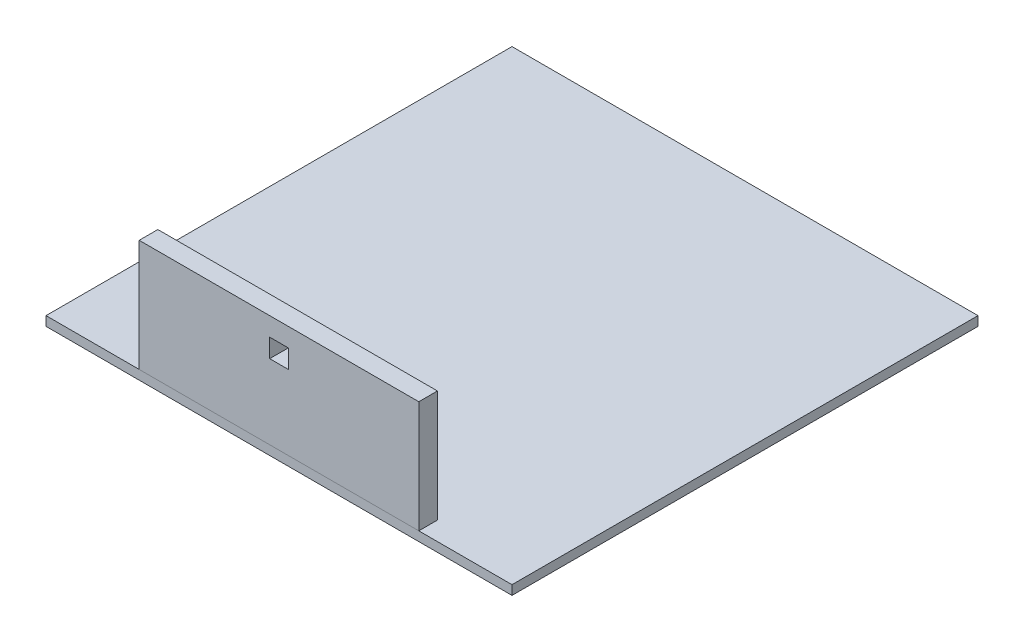
ISO-10303-21;
HEADER;
FILE_DESCRIPTION(('STEP AP214'),'2;1');
FILE_NAME('part.step','',(''),(''),'','','');
FILE_SCHEMA(('AUTOMOTIVE_DESIGN { 1 0 10303 214 1 1 1 1 }'));
ENDSEC;
DATA;
#1=APPLICATION_CONTEXT('core data for automotive mechanical design processes');
#2=APPLICATION_PROTOCOL_DEFINITION('international standard','automotive_design',2000,#1);
#3=PRODUCT_CONTEXT('',#1,'mechanical');
#4=PRODUCT('Part','Part','',(#3));
#5=PRODUCT_RELATED_PRODUCT_CATEGORY('part','',(#4));
#6=PRODUCT_DEFINITION_FORMATION('','',#4);
#7=PRODUCT_DEFINITION_CONTEXT('part definition',#1,'design');
#8=PRODUCT_DEFINITION('design','',#6,#7);
#9=PRODUCT_DEFINITION_SHAPE('','',#8);
#10=(LENGTH_UNIT() NAMED_UNIT(*) SI_UNIT(.MILLI.,.METRE.));
#11=(NAMED_UNIT(*) PLANE_ANGLE_UNIT() SI_UNIT($,.RADIAN.));
#12=(NAMED_UNIT(*) SI_UNIT($,.STERADIAN.) SOLID_ANGLE_UNIT());
#13=UNCERTAINTY_MEASURE_WITH_UNIT(LENGTH_MEASURE(1.E-05),#10,'distance_accuracy_value','');
#14=(GEOMETRIC_REPRESENTATION_CONTEXT(3) GLOBAL_UNCERTAINTY_ASSIGNED_CONTEXT((#13)) GLOBAL_UNIT_ASSIGNED_CONTEXT((#10,
#11,#12)) REPRESENTATION_CONTEXT('',''));
#15=CARTESIAN_POINT('',(0.,0.,0.));
#16=DIRECTION('',(0.,0.,1.));
#17=DIRECTION('',(1.,0.,0.));
#18=AXIS2_PLACEMENT_3D('',#15,#16,#17);
#19=CARTESIAN_POINT('',(150.,130.,230.));
#20=DIRECTION('',(-1.,0.,0.));
#21=DIRECTION('',(0.,0.,1.));
#22=AXIS2_PLACEMENT_3D('',#19,#20,#21);
#23=PLANE('',#22);
#24=DIRECTION('',(0.,0.,-1.));
#25=VECTOR('',#24,1.);
#26=CARTESIAN_POINT('',(150.,10.,230.));
#27=LINE('',#26,#25);
#28=CARTESIAN_POINT('',(150.,10.,250.));
#29=VERTEX_POINT('',#28);
#30=CARTESIAN_POINT('',(150.,10.,230.));
#31=VERTEX_POINT('',#30);
#32=EDGE_CURVE('E150',#29,#31,#27,.T.);
#33=ORIENTED_EDGE('',*,*,#32,.T.);
#34=DIRECTION('',(0.,-1.,0.));
#35=VECTOR('',#34,1.);
#36=CARTESIAN_POINT('',(150.,130.,230.));
#37=LINE('',#36,#35);
#38=CARTESIAN_POINT('',(150.,130.,230.));
#39=VERTEX_POINT('',#38);
#40=EDGE_CURVE('E12',#39,#31,#37,.T.);
#41=ORIENTED_EDGE('',*,*,#40,.F.);
#42=DIRECTION('',(0.,0.,-1.));
#43=VECTOR('',#42,1.);
#44=CARTESIAN_POINT('',(150.,130.,230.));
#45=LINE('',#44,#43);
#46=CARTESIAN_POINT('',(150.,130.,250.));
#47=VERTEX_POINT('',#46);
#48=EDGE_CURVE('E151',#47,#39,#45,.T.);
#49=ORIENTED_EDGE('',*,*,#48,.F.);
#50=DIRECTION('',(0.,-1.,0.));
#51=VECTOR('',#50,1.);
#52=CARTESIAN_POINT('',(150.,130.,250.));
#53=LINE('',#52,#51);
#54=EDGE_CURVE('E161',#47,#29,#53,.T.);
#55=ORIENTED_EDGE('',*,*,#54,.T.);
#56=EDGE_LOOP('',(#33,#41,#49,#55));
#57=FACE_BOUND('',#56,.T.);
#58=ADVANCED_FACE('F49',(#57),#23,.F.);
#59=CARTESIAN_POINT('',(-150.,130.,230.));
#60=DIRECTION('',(0.,0.,1.));
#61=DIRECTION('',(1.,0.,0.));
#62=AXIS2_PLACEMENT_3D('',#59,#60,#61);
#63=PLANE('',#62);
#64=DIRECTION('',(1.,0.,0.));
#65=VECTOR('',#64,1.);
#66=CARTESIAN_POINT('',(-150.,90.,230.));
#67=LINE('',#66,#65);
#68=CARTESIAN_POINT('',(-10.,90.,230.));
#69=VERTEX_POINT('',#68);
#70=CARTESIAN_POINT('',(9.99999999999999,90.,230.));
#71=VERTEX_POINT('',#70);
#72=EDGE_CURVE('E144',#69,#71,#67,.T.);
#73=ORIENTED_EDGE('',*,*,#72,.T.);
#74=DIRECTION('',(0.,1.,0.));
#75=VECTOR('',#74,1.);
#76=CARTESIAN_POINT('',(9.99999999999998,130.,230.));
#77=LINE('',#76,#75);
#78=CARTESIAN_POINT('',(9.99999999999999,110.,230.));
#79=VERTEX_POINT('',#78);
#80=EDGE_CURVE('E147',#71,#79,#77,.T.);
#81=ORIENTED_EDGE('',*,*,#80,.T.);
#82=DIRECTION('',(-1.,0.,0.));
#83=VECTOR('',#82,1.);
#84=CARTESIAN_POINT('',(-150.,110.,230.));
#85=LINE('',#84,#83);
#86=CARTESIAN_POINT('',(-10.,110.,230.));
#87=VERTEX_POINT('',#86);
#88=EDGE_CURVE('E139',#79,#87,#85,.T.);
#89=ORIENTED_EDGE('',*,*,#88,.T.);
#90=DIRECTION('',(0.,-1.,0.));
#91=VECTOR('',#90,1.);
#92=CARTESIAN_POINT('',(-10.,130.,230.));
#93=LINE('',#92,#91);
#94=EDGE_CURVE('E119',#87,#69,#93,.T.);
#95=ORIENTED_EDGE('',*,*,#94,.T.);
#96=EDGE_LOOP('',(#73,#81,#89,#95));
#97=FACE_BOUND('',#96,.T.);
#98=DIRECTION('',(-1.,0.,0.));
#99=VECTOR('',#98,1.);
#100=CARTESIAN_POINT('',(-150.,10.,230.));
#101=LINE('',#100,#99);
#102=CARTESIAN_POINT('',(-150.,10.,230.));
#103=VERTEX_POINT('',#102);
#104=EDGE_CURVE('E164',#31,#103,#101,.T.);
#105=ORIENTED_EDGE('',*,*,#104,.T.);
#106=DIRECTION('',(0.,-1.,0.));
#107=VECTOR('',#106,1.);
#108=CARTESIAN_POINT('',(-150.,130.,230.));
#109=LINE('',#108,#107);
#110=CARTESIAN_POINT('',(-150.,130.,230.));
#111=VERTEX_POINT('',#110);
#112=EDGE_CURVE('E56',#111,#103,#109,.T.);
#113=ORIENTED_EDGE('',*,*,#112,.F.);
#114=DIRECTION('',(-1.,0.,0.));
#115=VECTOR('',#114,1.);
#116=CARTESIAN_POINT('',(-150.,130.,230.));
#117=LINE('',#116,#115);
#118=EDGE_CURVE('E154',#39,#111,#117,.T.);
#119=ORIENTED_EDGE('',*,*,#118,.F.);
#120=ORIENTED_EDGE('',*,*,#40,.T.);
#121=EDGE_LOOP('',(#105,#113,#119,#120));
#122=FACE_BOUND('',#121,.T.);
#123=ADVANCED_FACE('F192',(#97,#122),#63,.F.);
#124=CARTESIAN_POINT('',(-150.,130.,230.));
#125=DIRECTION('',(1.,0.,0.));
#126=DIRECTION('',(0.,0.,-1.));
#127=AXIS2_PLACEMENT_3D('',#124,#125,#126);
#128=PLANE('',#127);
#129=DIRECTION('',(0.,0.,1.));
#130=VECTOR('',#129,1.);
#131=CARTESIAN_POINT('',(-150.,10.,230.));
#132=LINE('',#131,#130);
#133=CARTESIAN_POINT('',(-150.,10.,250.));
#134=VERTEX_POINT('',#133);
#135=EDGE_CURVE('E166',#103,#134,#132,.T.);
#136=ORIENTED_EDGE('',*,*,#135,.T.);
#137=DIRECTION('',(0.,-1.,0.));
#138=VECTOR('',#137,1.);
#139=CARTESIAN_POINT('',(-150.,130.,250.));
#140=LINE('',#139,#138);
#141=CARTESIAN_POINT('',(-150.,130.,250.));
#142=VERTEX_POINT('',#141);
#143=EDGE_CURVE('E171',#142,#134,#140,.T.);
#144=ORIENTED_EDGE('',*,*,#143,.F.);
#145=DIRECTION('',(0.,0.,1.));
#146=VECTOR('',#145,1.);
#147=CARTESIAN_POINT('',(-150.,130.,230.));
#148=LINE('',#147,#146);
#149=EDGE_CURVE('E157',#111,#142,#148,.T.);
#150=ORIENTED_EDGE('',*,*,#149,.F.);
#151=ORIENTED_EDGE('',*,*,#112,.T.);
#152=EDGE_LOOP('',(#136,#144,#150,#151));
#153=FACE_BOUND('',#152,.T.);
#154=ADVANCED_FACE('F178',(#153),#128,.F.);
#155=CARTESIAN_POINT('',(-150.,130.,250.));
#156=DIRECTION('',(0.,0.,-1.));
#157=DIRECTION('',(-1.,0.,0.));
#158=AXIS2_PLACEMENT_3D('',#155,#156,#157);
#159=PLANE('',#158);
#160=DIRECTION('',(-1.,0.,0.));
#161=VECTOR('',#160,1.);
#162=CARTESIAN_POINT('',(-10.,110.,250.));
#163=LINE('',#162,#161);
#164=CARTESIAN_POINT('',(9.99999999999998,110.,250.));
#165=VERTEX_POINT('',#164);
#166=CARTESIAN_POINT('',(-10.,110.,250.));
#167=VERTEX_POINT('',#166);
#168=EDGE_CURVE('E125',#165,#167,#163,.T.);
#169=ORIENTED_EDGE('',*,*,#168,.F.);
#170=DIRECTION('',(0.,1.,0.));
#171=VECTOR('',#170,1.);
#172=CARTESIAN_POINT('',(9.99999999999999,90.,250.));
#173=LINE('',#172,#171);
#174=CARTESIAN_POINT('',(9.99999999999999,90.,250.));
#175=VERTEX_POINT('',#174);
#176=EDGE_CURVE('E71',#175,#165,#173,.T.);
#177=ORIENTED_EDGE('',*,*,#176,.F.);
#178=DIRECTION('',(1.,0.,0.));
#179=VECTOR('',#178,1.);
#180=CARTESIAN_POINT('',(-10.,90.,250.));
#181=LINE('',#180,#179);
#182=CARTESIAN_POINT('',(-10.,90.,250.));
#183=VERTEX_POINT('',#182);
#184=EDGE_CURVE('E132',#183,#175,#181,.T.);
#185=ORIENTED_EDGE('',*,*,#184,.F.);
#186=DIRECTION('',(0.,-1.,0.));
#187=VECTOR('',#186,1.);
#188=CARTESIAN_POINT('',(-10.,90.,250.));
#189=LINE('',#188,#187);
#190=EDGE_CURVE('E116',#167,#183,#189,.T.);
#191=ORIENTED_EDGE('',*,*,#190,.F.);
#192=EDGE_LOOP('',(#169,#177,#185,#191));
#193=FACE_BOUND('',#192,.T.);
#194=DIRECTION('',(1.,0.,0.));
#195=VECTOR('',#194,1.);
#196=CARTESIAN_POINT('',(-150.,10.,250.));
#197=LINE('',#196,#195);
#198=EDGE_CURVE('E155',#134,#29,#197,.T.);
#199=ORIENTED_EDGE('',*,*,#198,.T.);
#200=ORIENTED_EDGE('',*,*,#54,.F.);
#201=DIRECTION('',(1.,0.,0.));
#202=VECTOR('',#201,1.);
#203=CARTESIAN_POINT('',(-150.,130.,250.));
#204=LINE('',#203,#202);
#205=EDGE_CURVE('E159',#142,#47,#204,.T.);
#206=ORIENTED_EDGE('',*,*,#205,.F.);
#207=ORIENTED_EDGE('',*,*,#143,.T.);
#208=EDGE_LOOP('',(#199,#200,#206,#207));
#209=FACE_BOUND('',#208,.T.);
#210=ADVANCED_FACE('F129',(#193,#209),#159,.F.);
#211=CARTESIAN_POINT('',(0.,130.,0.));
#212=DIRECTION('',(0.,1.,0.));
#213=DIRECTION('',(0.,0.,1.));
#214=AXIS2_PLACEMENT_3D('',#211,#212,#213);
#215=PLANE('',#214);
#216=ORIENTED_EDGE('',*,*,#48,.T.);
#217=ORIENTED_EDGE('',*,*,#118,.T.);
#218=ORIENTED_EDGE('',*,*,#149,.T.);
#219=ORIENTED_EDGE('',*,*,#205,.T.);
#220=EDGE_LOOP('',(#216,#217,#218,#219));
#221=FACE_BOUND('',#220,.T.);
#222=ADVANCED_FACE('F191',(#221),#215,.T.);
#223=CARTESIAN_POINT('',(0.,10.,0.));
#224=DIRECTION('',(0.,1.,0.));
#225=DIRECTION('',(0.,0.,1.));
#226=AXIS2_PLACEMENT_3D('',#223,#224,#225);
#227=PLANE('',#226);
#228=ORIENTED_EDGE('',*,*,#32,.F.);
#229=ORIENTED_EDGE('',*,*,#198,.F.);
#230=ORIENTED_EDGE('',*,*,#135,.F.);
#231=ORIENTED_EDGE('',*,*,#104,.F.);
#232=EDGE_LOOP('',(#228,#229,#230,#231));
#233=FACE_BOUND('',#232,.T.);
#234=ADVANCED_FACE('F184',(#233),#227,.F.);
#235=CARTESIAN_POINT('',(9.99999999999999,90.,-250.));
#236=DIRECTION('',(1.,0.,0.));
#237=DIRECTION('',(0.,0.,-1.));
#238=AXIS2_PLACEMENT_3D('',#235,#236,#237);
#239=PLANE('',#238);
#240=DIRECTION('',(0.,0.,1.));
#241=VECTOR('',#240,1.);
#242=CARTESIAN_POINT('',(9.99999999999999,90.,-250.));
#243=LINE('',#242,#241);
#244=EDGE_CURVE('E137',#71,#175,#243,.T.);
#245=ORIENTED_EDGE('',*,*,#244,.T.);
#246=ORIENTED_EDGE('',*,*,#176,.T.);
#247=DIRECTION('',(0.,0.,1.));
#248=VECTOR('',#247,1.);
#249=CARTESIAN_POINT('',(9.99999999999999,110.,-250.));
#250=LINE('',#249,#248);
#251=EDGE_CURVE('E122',#79,#165,#250,.T.);
#252=ORIENTED_EDGE('',*,*,#251,.F.);
#253=ORIENTED_EDGE('',*,*,#80,.F.);
#254=EDGE_LOOP('',(#245,#246,#252,#253));
#255=FACE_BOUND('',#254,.T.);
#256=ADVANCED_FACE('F206',(#255),#239,.F.);
#257=CARTESIAN_POINT('',(-10.,90.,-250.));
#258=DIRECTION('',(0.,-1.,0.));
#259=DIRECTION('',(0.,0.,-1.));
#260=AXIS2_PLACEMENT_3D('',#257,#258,#259);
#261=PLANE('',#260);
#262=DIRECTION('',(0.,0.,1.));
#263=VECTOR('',#262,1.);
#264=CARTESIAN_POINT('',(-10.,90.,-250.));
#265=LINE('',#264,#263);
#266=EDGE_CURVE('E121',#69,#183,#265,.T.);
#267=ORIENTED_EDGE('',*,*,#266,.T.);
#268=ORIENTED_EDGE('',*,*,#184,.T.);
#269=ORIENTED_EDGE('',*,*,#244,.F.);
#270=ORIENTED_EDGE('',*,*,#72,.F.);
#271=EDGE_LOOP('',(#267,#268,#269,#270));
#272=FACE_BOUND('',#271,.T.);
#273=ADVANCED_FACE('F211',(#272),#261,.F.);
#274=CARTESIAN_POINT('',(-10.,90.,-250.));
#275=DIRECTION('',(-1.,0.,0.));
#276=DIRECTION('',(0.,0.,1.));
#277=AXIS2_PLACEMENT_3D('',#274,#275,#276);
#278=PLANE('',#277);
#279=DIRECTION('',(0.,0.,1.));
#280=VECTOR('',#279,1.);
#281=CARTESIAN_POINT('',(-10.,110.,-250.));
#282=LINE('',#281,#280);
#283=EDGE_CURVE('E63',#87,#167,#282,.T.);
#284=ORIENTED_EDGE('',*,*,#283,.T.);
#285=ORIENTED_EDGE('',*,*,#190,.T.);
#286=ORIENTED_EDGE('',*,*,#266,.F.);
#287=ORIENTED_EDGE('',*,*,#94,.F.);
#288=EDGE_LOOP('',(#284,#285,#286,#287));
#289=FACE_BOUND('',#288,.T.);
#290=ADVANCED_FACE('F113',(#289),#278,.F.);
#291=CARTESIAN_POINT('',(-10.,110.,-250.));
#292=DIRECTION('',(0.,1.,0.));
#293=DIRECTION('',(0.,0.,1.));
#294=AXIS2_PLACEMENT_3D('',#291,#292,#293);
#295=PLANE('',#294);
#296=ORIENTED_EDGE('',*,*,#251,.T.);
#297=ORIENTED_EDGE('',*,*,#168,.T.);
#298=ORIENTED_EDGE('',*,*,#283,.F.);
#299=ORIENTED_EDGE('',*,*,#88,.F.);
#300=EDGE_LOOP('',(#296,#297,#298,#299));
#301=FACE_BOUND('',#300,.T.);
#302=ADVANCED_FACE('F126',(#301),#295,.F.);
#303=CLOSED_SHELL('',(#58,#123,#154,#210,#222,#234,#256,#273,#290,#302));
#304=MANIFOLD_SOLID_BREP('B2',#303);
#305=CARTESIAN_POINT('',(250.,10.,250.));
#306=DIRECTION('',(-1.,0.,0.));
#307=DIRECTION('',(0.,0.,1.));
#308=AXIS2_PLACEMENT_3D('',#305,#306,#307);
#309=PLANE('',#308);
#310=DIRECTION('',(0.,0.,-1.));
#311=VECTOR('',#310,1.);
#312=CARTESIAN_POINT('',(250.,0.,250.));
#313=LINE('',#312,#311);
#314=CARTESIAN_POINT('',(250.,0.,250.));
#315=VERTEX_POINT('',#314);
#316=CARTESIAN_POINT('',(250.,0.,-250.));
#317=VERTEX_POINT('',#316);
#318=EDGE_CURVE('E381',#315,#317,#313,.T.);
#319=ORIENTED_EDGE('',*,*,#318,.T.);
#320=DIRECTION('',(0.,-1.,0.));
#321=VECTOR('',#320,1.);
#322=CARTESIAN_POINT('',(250.,10.,-250.));
#323=LINE('',#322,#321);
#324=CARTESIAN_POINT('',(250.,10.,-250.));
#325=VERTEX_POINT('',#324);
#326=EDGE_CURVE('E47',#325,#317,#323,.T.);
#327=ORIENTED_EDGE('',*,*,#326,.F.);
#328=DIRECTION('',(0.,0.,-1.));
#329=VECTOR('',#328,1.);
#330=CARTESIAN_POINT('',(250.,10.,250.));
#331=LINE('',#330,#329);
#332=CARTESIAN_POINT('',(250.,10.,250.));
#333=VERTEX_POINT('',#332);
#334=EDGE_CURVE('E369',#333,#325,#331,.T.);
#335=ORIENTED_EDGE('',*,*,#334,.F.);
#336=DIRECTION('',(0.,-1.,0.));
#337=VECTOR('',#336,1.);
#338=CARTESIAN_POINT('',(250.,10.,250.));
#339=LINE('',#338,#337);
#340=EDGE_CURVE('E377',#333,#315,#339,.T.);
#341=ORIENTED_EDGE('',*,*,#340,.T.);
#342=EDGE_LOOP('',(#319,#327,#335,#341));
#343=FACE_BOUND('',#342,.T.);
#344=ADVANCED_FACE('F318',(#343),#309,.F.);
#345=CARTESIAN_POINT('',(-250.,10.,-250.));
#346=DIRECTION('',(0.,0.,1.));
#347=DIRECTION('',(1.,0.,0.));
#348=AXIS2_PLACEMENT_3D('',#345,#346,#347);
#349=PLANE('',#348);
#350=DIRECTION('',(-1.,0.,0.));
#351=VECTOR('',#350,1.);
#352=CARTESIAN_POINT('',(-250.,0.,-250.));
#353=LINE('',#352,#351);
#354=CARTESIAN_POINT('',(-250.,0.,-250.));
#355=VERTEX_POINT('',#354);
#356=EDGE_CURVE('E373',#317,#355,#353,.T.);
#357=ORIENTED_EDGE('',*,*,#356,.T.);
#358=DIRECTION('',(0.,-1.,0.));
#359=VECTOR('',#358,1.);
#360=CARTESIAN_POINT('',(-250.,10.,-250.));
#361=LINE('',#360,#359);
#362=CARTESIAN_POINT('',(-250.,10.,-250.));
#363=VERTEX_POINT('',#362);
#364=EDGE_CURVE('E326',#363,#355,#361,.T.);
#365=ORIENTED_EDGE('',*,*,#364,.F.);
#366=DIRECTION('',(-1.,0.,0.));
#367=VECTOR('',#366,1.);
#368=CARTESIAN_POINT('',(-250.,10.,-250.));
#369=LINE('',#368,#367);
#370=EDGE_CURVE('E364',#325,#363,#369,.T.);
#371=ORIENTED_EDGE('',*,*,#370,.F.);
#372=ORIENTED_EDGE('',*,*,#326,.T.);
#373=EDGE_LOOP('',(#357,#365,#371,#372));
#374=FACE_BOUND('',#373,.T.);
#375=ADVANCED_FACE('F372',(#374),#349,.F.);
#376=CARTESIAN_POINT('',(-250.,10.,250.));
#377=DIRECTION('',(1.,0.,0.));
#378=DIRECTION('',(0.,0.,-1.));
#379=AXIS2_PLACEMENT_3D('',#376,#377,#378);
#380=PLANE('',#379);
#381=DIRECTION('',(0.,0.,1.));
#382=VECTOR('',#381,1.);
#383=CARTESIAN_POINT('',(-250.,0.,250.));
#384=LINE('',#383,#382);
#385=CARTESIAN_POINT('',(-250.,0.,250.));
#386=VERTEX_POINT('',#385);
#387=EDGE_CURVE('E351',#355,#386,#384,.T.);
#388=ORIENTED_EDGE('',*,*,#387,.T.);
#389=DIRECTION('',(0.,-1.,0.));
#390=VECTOR('',#389,1.);
#391=CARTESIAN_POINT('',(-250.,10.,250.));
#392=LINE('',#391,#390);
#393=CARTESIAN_POINT('',(-250.,10.,250.));
#394=VERTEX_POINT('',#393);
#395=EDGE_CURVE('E374',#394,#386,#392,.T.);
#396=ORIENTED_EDGE('',*,*,#395,.F.);
#397=DIRECTION('',(0.,0.,1.));
#398=VECTOR('',#397,1.);
#399=CARTESIAN_POINT('',(-250.,10.,250.));
#400=LINE('',#399,#398);
#401=EDGE_CURVE('E367',#363,#394,#400,.T.);
#402=ORIENTED_EDGE('',*,*,#401,.F.);
#403=ORIENTED_EDGE('',*,*,#364,.T.);
#404=EDGE_LOOP('',(#388,#396,#402,#403));
#405=FACE_BOUND('',#404,.T.);
#406=ADVANCED_FACE('F375',(#405),#380,.F.);
#407=CARTESIAN_POINT('',(-250.,10.,250.));
#408=DIRECTION('',(0.,0.,-1.));
#409=DIRECTION('',(-1.,0.,0.));
#410=AXIS2_PLACEMENT_3D('',#407,#408,#409);
#411=PLANE('',#410);
#412=DIRECTION('',(1.,0.,0.));
#413=VECTOR('',#412,1.);
#414=CARTESIAN_POINT('',(-250.,0.,250.));
#415=LINE('',#414,#413);
#416=EDGE_CURVE('E357',#386,#315,#415,.T.);
#417=ORIENTED_EDGE('',*,*,#416,.T.);
#418=ORIENTED_EDGE('',*,*,#340,.F.);
#419=DIRECTION('',(1.,0.,0.));
#420=VECTOR('',#419,1.);
#421=CARTESIAN_POINT('',(-250.,10.,250.));
#422=LINE('',#421,#420);
#423=EDGE_CURVE('E334',#394,#333,#422,.T.);
#424=ORIENTED_EDGE('',*,*,#423,.F.);
#425=ORIENTED_EDGE('',*,*,#395,.T.);
#426=EDGE_LOOP('',(#417,#418,#424,#425));
#427=FACE_BOUND('',#426,.T.);
#428=ADVANCED_FACE('F388',(#427),#411,.F.);
#429=CARTESIAN_POINT('',(0.,10.,0.));
#430=DIRECTION('',(0.,-1.,0.));
#431=DIRECTION('',(0.,0.,-1.));
#432=AXIS2_PLACEMENT_3D('',#429,#430,#431);
#433=PLANE('',#432);
#434=ORIENTED_EDGE('',*,*,#334,.T.);
#435=ORIENTED_EDGE('',*,*,#370,.T.);
#436=ORIENTED_EDGE('',*,*,#401,.T.);
#437=ORIENTED_EDGE('',*,*,#423,.T.);
#438=EDGE_LOOP('',(#434,#435,#436,#437));
#439=FACE_BOUND('',#438,.T.);
#440=ADVANCED_FACE('F365',(#439),#433,.F.);
#441=CARTESIAN_POINT('',(0.,0.,0.));
#442=DIRECTION('',(0.,-1.,0.));
#443=DIRECTION('',(0.,0.,-1.));
#444=AXIS2_PLACEMENT_3D('',#441,#442,#443);
#445=PLANE('',#444);
#446=ORIENTED_EDGE('',*,*,#318,.F.);
#447=ORIENTED_EDGE('',*,*,#416,.F.);
#448=ORIENTED_EDGE('',*,*,#387,.F.);
#449=ORIENTED_EDGE('',*,*,#356,.F.);
#450=EDGE_LOOP('',(#446,#447,#448,#449));
#451=FACE_BOUND('',#450,.T.);
#452=ADVANCED_FACE('F391',(#451),#445,.T.);
#453=CLOSED_SHELL('',(#344,#375,#406,#428,#440,#452));
#454=MANIFOLD_SOLID_BREP('B6',#453);
#455=ADVANCED_BREP_SHAPE_REPRESENTATION('',(#18,#304,#454),#14);
#456=SHAPE_DEFINITION_REPRESENTATION(#9,#455);
ENDSEC;
END-ISO-10303-21;
